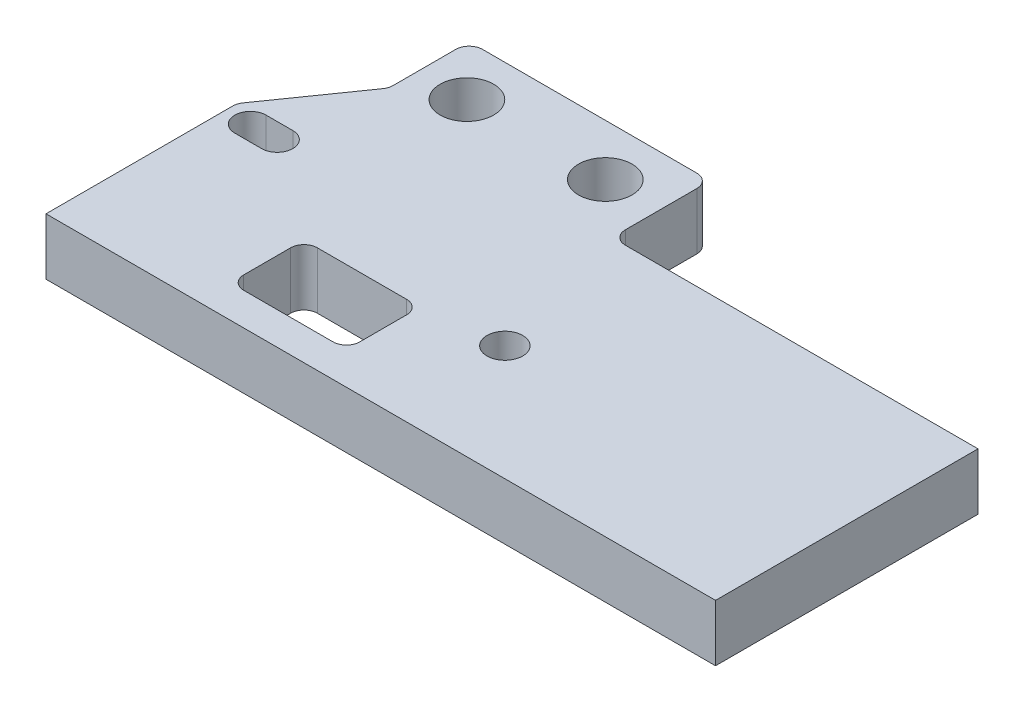
ISO-10303-21;
HEADER;
FILE_DESCRIPTION(('STEP AP214'),'2;1');
FILE_NAME('part.step','',(''),(''),'','','');
FILE_SCHEMA(('AUTOMOTIVE_DESIGN { 1 0 10303 214 1 1 1 1 }'));
ENDSEC;
DATA;
#1=APPLICATION_CONTEXT('core data for automotive mechanical design processes');
#2=APPLICATION_PROTOCOL_DEFINITION('international standard','automotive_design',2000,#1);
#3=PRODUCT_CONTEXT('',#1,'mechanical');
#4=PRODUCT('Part','Part','',(#3));
#5=PRODUCT_RELATED_PRODUCT_CATEGORY('part','',(#4));
#6=PRODUCT_DEFINITION_FORMATION('','',#4);
#7=PRODUCT_DEFINITION_CONTEXT('part definition',#1,'design');
#8=PRODUCT_DEFINITION('design','',#6,#7);
#9=PRODUCT_DEFINITION_SHAPE('','',#8);
#10=(LENGTH_UNIT() NAMED_UNIT(*) SI_UNIT(.MILLI.,.METRE.));
#11=(NAMED_UNIT(*) PLANE_ANGLE_UNIT() SI_UNIT($,.RADIAN.));
#12=(NAMED_UNIT(*) SI_UNIT($,.STERADIAN.) SOLID_ANGLE_UNIT());
#13=UNCERTAINTY_MEASURE_WITH_UNIT(LENGTH_MEASURE(1.E-05),#10,'distance_accuracy_value','');
#14=(GEOMETRIC_REPRESENTATION_CONTEXT(3) GLOBAL_UNCERTAINTY_ASSIGNED_CONTEXT((#13)) GLOBAL_UNIT_ASSIGNED_CONTEXT((#10,
#11,#12)) REPRESENTATION_CONTEXT('',''));
#15=CARTESIAN_POINT('',(0.,0.,0.));
#16=DIRECTION('',(0.,0.,1.));
#17=DIRECTION('',(1.,0.,0.));
#18=AXIS2_PLACEMENT_3D('',#15,#16,#17);
#19=CARTESIAN_POINT('',(0.,6.35,0.));
#20=DIRECTION('',(0.,-1.,0.));
#21=DIRECTION('',(0.,0.,-1.));
#22=AXIS2_PLACEMENT_3D('',#19,#20,#21);
#23=PLANE('',#22);
#24=CARTESIAN_POINT('',(28.,6.35,-61.75));
#25=DIRECTION('',(0.,1.,0.));
#26=DIRECTION('',(0.,0.,1.));
#27=AXIS2_PLACEMENT_3D('',#24,#25,#26);
#28=CIRCLE('',#27,3.);
#29=CARTESIAN_POINT('',(28.,6.35,-58.75));
#30=VERTEX_POINT('',#29);
#31=EDGE_CURVE('E224',#30,#30,#28,.T.);
#32=ORIENTED_EDGE('',*,*,#31,.F.);
#33=EDGE_LOOP('',(#32));
#34=FACE_BOUND('',#33,.T.);
#35=CARTESIAN_POINT('',(12.5,6.35,-61.75));
#36=DIRECTION('',(0.,1.,0.));
#37=DIRECTION('',(0.,0.,1.));
#38=AXIS2_PLACEMENT_3D('',#35,#36,#37);
#39=CIRCLE('',#38,3.);
#40=CARTESIAN_POINT('',(12.5,6.35,-58.75));
#41=VERTEX_POINT('',#40);
#42=EDGE_CURVE('E228',#41,#41,#39,.T.);
#43=ORIENTED_EDGE('',*,*,#42,.F.);
#44=EDGE_LOOP('',(#43));
#45=FACE_BOUND('',#44,.T.);
#46=CARTESIAN_POINT('',(2.75,6.35,-47.25));
#47=DIRECTION('',(0.,1.,0.));
#48=DIRECTION('',(0.,0.,-1.));
#49=AXIS2_PLACEMENT_3D('',#46,#47,#48);
#50=CIRCLE('',#49,1.75);
#51=CARTESIAN_POINT('',(2.75,6.35,-49.));
#52=VERTEX_POINT('',#51);
#53=CARTESIAN_POINT('',(2.75,6.35,-45.5));
#54=VERTEX_POINT('',#53);
#55=EDGE_CURVE('E239',#52,#54,#50,.T.);
#56=ORIENTED_EDGE('',*,*,#55,.F.);
#57=DIRECTION('',(-1.,0.,0.));
#58=VECTOR('',#57,1.);
#59=CARTESIAN_POINT('',(2.75,6.35,-49.));
#60=LINE('',#59,#58);
#61=CARTESIAN_POINT('',(5.75,6.35,-49.));
#62=VERTEX_POINT('',#61);
#63=EDGE_CURVE('E250',#62,#52,#60,.T.);
#64=ORIENTED_EDGE('',*,*,#63,.F.);
#65=CARTESIAN_POINT('',(5.75,6.35,-47.25));
#66=DIRECTION('',(0.,1.,0.));
#67=DIRECTION('',(0.,0.,-1.));
#68=AXIS2_PLACEMENT_3D('',#65,#66,#67);
#69=CIRCLE('',#68,1.75);
#70=CARTESIAN_POINT('',(5.75,6.35,-45.5));
#71=VERTEX_POINT('',#70);
#72=EDGE_CURVE('E246',#71,#62,#69,.T.);
#73=ORIENTED_EDGE('',*,*,#72,.F.);
#74=DIRECTION('',(1.,0.,0.));
#75=VECTOR('',#74,1.);
#76=CARTESIAN_POINT('',(2.75,6.35,-45.5));
#77=LINE('',#76,#75);
#78=EDGE_CURVE('E243',#54,#71,#77,.T.);
#79=ORIENTED_EDGE('',*,*,#78,.F.);
#80=EDGE_LOOP('',(#56,#64,#73,#79));
#81=FACE_BOUND('',#80,.T.);
#82=CARTESIAN_POINT('',(38.5,6.35,-40.));
#83=DIRECTION('',(0.,1.,0.));
#84=DIRECTION('',(0.,0.,1.));
#85=AXIS2_PLACEMENT_3D('',#82,#83,#84);
#86=CIRCLE('',#85,2.);
#87=CARTESIAN_POINT('',(38.5,6.35,-38.));
#88=VERTEX_POINT('',#87);
#89=EDGE_CURVE('E242',#88,#88,#86,.T.);
#90=ORIENTED_EDGE('',*,*,#89,.F.);
#91=EDGE_LOOP('',(#90));
#92=FACE_BOUND('',#91,.T.);
#93=DIRECTION('',(0.,0.,1.));
#94=VECTOR('',#93,1.);
#95=CARTESIAN_POINT('',(17.,6.35,-39.));
#96=LINE('',#95,#94);
#97=CARTESIAN_POINT('',(17.,6.35,-37.5));
#98=VERTEX_POINT('',#97);
#99=CARTESIAN_POINT('',(17.,6.35,-32.25));
#100=VERTEX_POINT('',#99);
#101=EDGE_CURVE('E276',#98,#100,#96,.T.);
#102=ORIENTED_EDGE('',*,*,#101,.F.);
#103=CARTESIAN_POINT('',(18.5,6.35,-37.5));
#104=DIRECTION('',(0.,-1.,0.));
#105=DIRECTION('',(0.,0.,-1.));
#106=AXIS2_PLACEMENT_3D('',#103,#104,#105);
#107=CIRCLE('',#106,1.5);
#108=CARTESIAN_POINT('',(18.5,6.35,-39.));
#109=VERTEX_POINT('',#108);
#110=EDGE_CURVE('E390',#98,#109,#107,.T.);
#111=ORIENTED_EDGE('',*,*,#110,.T.);
#112=DIRECTION('',(-1.,0.,0.));
#113=VECTOR('',#112,1.);
#114=CARTESIAN_POINT('',(17.,6.35,-39.));
#115=LINE('',#114,#113);
#116=CARTESIAN_POINT('',(28.5,6.35,-39.));
#117=VERTEX_POINT('',#116);
#118=EDGE_CURVE('E291',#117,#109,#115,.T.);
#119=ORIENTED_EDGE('',*,*,#118,.F.);
#120=CARTESIAN_POINT('',(28.5,6.35,-37.5));
#121=DIRECTION('',(0.,-1.,0.));
#122=DIRECTION('',(0.,0.,-1.));
#123=AXIS2_PLACEMENT_3D('',#120,#121,#122);
#124=CIRCLE('',#123,1.5);
#125=CARTESIAN_POINT('',(30.,6.35,-37.5));
#126=VERTEX_POINT('',#125);
#127=EDGE_CURVE('E392',#117,#126,#124,.T.);
#128=ORIENTED_EDGE('',*,*,#127,.T.);
#129=DIRECTION('',(0.,0.,-1.));
#130=VECTOR('',#129,1.);
#131=CARTESIAN_POINT('',(30.,6.35,-39.));
#132=LINE('',#131,#130);
#133=CARTESIAN_POINT('',(30.,6.35,-32.25));
#134=VERTEX_POINT('',#133);
#135=EDGE_CURVE('E286',#134,#126,#132,.T.);
#136=ORIENTED_EDGE('',*,*,#135,.F.);
#137=CARTESIAN_POINT('',(28.5,6.35,-32.25));
#138=DIRECTION('',(0.,-1.,0.));
#139=DIRECTION('',(0.,0.,-1.));
#140=AXIS2_PLACEMENT_3D('',#137,#138,#139);
#141=CIRCLE('',#140,1.5);
#142=CARTESIAN_POINT('',(28.5,6.35,-30.75));
#143=VERTEX_POINT('',#142);
#144=EDGE_CURVE('E388',#134,#143,#141,.T.);
#145=ORIENTED_EDGE('',*,*,#144,.T.);
#146=DIRECTION('',(1.,0.,0.));
#147=VECTOR('',#146,1.);
#148=CARTESIAN_POINT('',(17.,6.35,-30.75));
#149=LINE('',#148,#147);
#150=CARTESIAN_POINT('',(18.5,6.35,-30.75));
#151=VERTEX_POINT('',#150);
#152=EDGE_CURVE('E281',#151,#143,#149,.T.);
#153=ORIENTED_EDGE('',*,*,#152,.F.);
#154=CARTESIAN_POINT('',(18.5,6.35,-32.25));
#155=DIRECTION('',(0.,-1.,0.));
#156=DIRECTION('',(0.,0.,-1.));
#157=AXIS2_PLACEMENT_3D('',#154,#155,#156);
#158=CIRCLE('',#157,1.5);
#159=EDGE_CURVE('E221',#151,#100,#158,.T.);
#160=ORIENTED_EDGE('',*,*,#159,.T.);
#161=EDGE_LOOP('',(#102,#111,#119,#128,#136,#145,#153,#160));
#162=FACE_BOUND('',#161,.T.);
#163=DIRECTION('',(0.,0.,1.));
#164=VECTOR('',#163,1.);
#165=CARTESIAN_POINT('',(0.,6.35,0.));
#166=LINE('',#165,#164);
#167=CARTESIAN_POINT('',(0.,6.35,-48.0271666537713));
#168=VERTEX_POINT('',#167);
#169=CARTESIAN_POINT('',(0.,6.35,-27.1));
#170=VERTEX_POINT('',#169);
#171=EDGE_CURVE('E205',#168,#170,#166,.T.);
#172=ORIENTED_EDGE('',*,*,#171,.T.);
#173=DIRECTION('',(1.,0.,0.));
#174=VECTOR('',#173,1.);
#175=CARTESIAN_POINT('',(-15.,6.35,-27.1));
#176=LINE('',#175,#174);
#177=CARTESIAN_POINT('',(75.,6.35,-27.1));
#178=VERTEX_POINT('',#177);
#179=EDGE_CURVE('E195',#170,#178,#176,.T.);
#180=ORIENTED_EDGE('',*,*,#179,.T.);
#181=DIRECTION('',(0.,0.,1.));
#182=VECTOR('',#181,1.);
#183=CARTESIAN_POINT('',(75.,6.35,0.));
#184=LINE('',#183,#182);
#185=CARTESIAN_POINT('',(75.,6.35,-56.5));
#186=VERTEX_POINT('',#185);
#187=EDGE_CURVE('E202',#186,#178,#184,.T.);
#188=ORIENTED_EDGE('',*,*,#187,.F.);
#189=DIRECTION('',(-1.,0.,0.));
#190=VECTOR('',#189,1.);
#191=CARTESIAN_POINT('',(34.,6.35,-56.5));
#192=LINE('',#191,#190);
#193=CARTESIAN_POINT('',(35.5,6.35,-56.5));
#194=VERTEX_POINT('',#193);
#195=EDGE_CURVE('E206',#186,#194,#192,.T.);
#196=ORIENTED_EDGE('',*,*,#195,.T.);
#197=CARTESIAN_POINT('',(35.5,6.35,-58.));
#198=DIRECTION('',(0.,-1.,0.));
#199=DIRECTION('',(0.,0.,-1.));
#200=AXIS2_PLACEMENT_3D('',#197,#198,#199);
#201=CIRCLE('',#200,1.5);
#202=CARTESIAN_POINT('',(34.,6.35,-58.));
#203=VERTEX_POINT('',#202);
#204=EDGE_CURVE('E310',#194,#203,#201,.T.);
#205=ORIENTED_EDGE('',*,*,#204,.T.);
#206=DIRECTION('',(0.,0.,-1.));
#207=VECTOR('',#206,1.);
#208=CARTESIAN_POINT('',(34.,6.35,-67.5));
#209=LINE('',#208,#207);
#210=CARTESIAN_POINT('',(34.,6.35,-66.));
#211=VERTEX_POINT('',#210);
#212=EDGE_CURVE('E311',#203,#211,#209,.T.);
#213=ORIENTED_EDGE('',*,*,#212,.T.);
#214=CARTESIAN_POINT('',(32.5,6.35,-66.));
#215=DIRECTION('',(0.,-1.,0.));
#216=DIRECTION('',(0.,0.,-1.));
#217=AXIS2_PLACEMENT_3D('',#214,#215,#216);
#218=CIRCLE('',#217,1.5);
#219=CARTESIAN_POINT('',(32.5,6.35,-67.5));
#220=VERTEX_POINT('',#219);
#221=EDGE_CURVE('E314',#211,#220,#218,.F.);
#222=ORIENTED_EDGE('',*,*,#221,.T.);
#223=DIRECTION('',(-1.,0.,0.));
#224=VECTOR('',#223,1.);
#225=CARTESIAN_POINT('',(7.,6.35,-67.5));
#226=LINE('',#225,#224);
#227=CARTESIAN_POINT('',(8.5,6.35,-67.5));
#228=VERTEX_POINT('',#227);
#229=EDGE_CURVE('E315',#220,#228,#226,.T.);
#230=ORIENTED_EDGE('',*,*,#229,.T.);
#231=CARTESIAN_POINT('',(8.5,6.35,-66.));
#232=DIRECTION('',(0.,-1.,0.));
#233=DIRECTION('',(0.,0.,-1.));
#234=AXIS2_PLACEMENT_3D('',#231,#232,#233);
#235=CIRCLE('',#234,1.5);
#236=CARTESIAN_POINT('',(7.,6.35,-66.));
#237=VERTEX_POINT('',#236);
#238=EDGE_CURVE('E318',#228,#237,#235,.F.);
#239=ORIENTED_EDGE('',*,*,#238,.T.);
#240=DIRECTION('',(0.,0.,1.));
#241=VECTOR('',#240,1.);
#242=CARTESIAN_POINT('',(7.,6.35,-58.5));
#243=LINE('',#242,#241);
#244=CARTESIAN_POINT('',(7.,6.35,-58.9728333462287));
#245=VERTEX_POINT('',#244);
#246=EDGE_CURVE('E319',#237,#245,#243,.T.);
#247=ORIENTED_EDGE('',*,*,#246,.T.);
#248=CARTESIAN_POINT('',(5.5,6.35,-58.9728333462287));
#249=DIRECTION('',(0.,-1.,0.));
#250=DIRECTION('',(0.,0.,-1.));
#251=AXIS2_PLACEMENT_3D('',#248,#249,#250);
#252=CIRCLE('',#251,1.5);
#253=CARTESIAN_POINT('',(6.72884788077856,6.35,-58.1126398296837));
#254=VERTEX_POINT('',#253);
#255=EDGE_CURVE('E322',#245,#254,#252,.T.);
#256=ORIENTED_EDGE('',*,*,#255,.T.);
#257=DIRECTION('',(-0.573462344363328,0.,0.819231920519041));
#258=VECTOR('',#257,1.);
#259=CARTESIAN_POINT('',(0.,6.35,-48.5));
#260=LINE('',#259,#258);
#261=CARTESIAN_POINT('',(0.271152119221439,6.35,-48.8873601703163));
#262=VERTEX_POINT('',#261);
#263=EDGE_CURVE('E323',#254,#262,#260,.T.);
#264=ORIENTED_EDGE('',*,*,#263,.T.);
#265=CARTESIAN_POINT('',(1.5,6.35,-48.0271666537714));
#266=DIRECTION('',(0.,-1.,0.));
#267=DIRECTION('',(0.,0.,-1.));
#268=AXIS2_PLACEMENT_3D('',#265,#266,#267);
#269=CIRCLE('',#268,1.5);
#270=EDGE_CURVE('E325',#262,#168,#269,.F.);
#271=ORIENTED_EDGE('',*,*,#270,.T.);
#272=EDGE_LOOP('',(#172,#180,#188,#196,#205,#213,#222,#230,#239,#247,#256,#264,#271));
#273=FACE_BOUND('',#272,.T.);
#274=ADVANCED_FACE('F32',(#34,#45,#81,#92,#162,#273),#23,.F.);
#275=CARTESIAN_POINT('',(0.,0.,0.));
#276=DIRECTION('',(0.,-1.,0.));
#277=DIRECTION('',(0.,0.,-1.));
#278=AXIS2_PLACEMENT_3D('',#275,#276,#277);
#279=PLANE('',#278);
#280=DIRECTION('',(1.,0.,0.));
#281=VECTOR('',#280,1.);
#282=CARTESIAN_POINT('',(-15.,0.,-27.1));
#283=LINE('',#282,#281);
#284=CARTESIAN_POINT('',(0.,0.,-27.1));
#285=VERTEX_POINT('',#284);
#286=CARTESIAN_POINT('',(75.,0.,-27.1));
#287=VERTEX_POINT('',#286);
#288=EDGE_CURVE('E41',#285,#287,#283,.T.);
#289=ORIENTED_EDGE('',*,*,#288,.F.);
#290=DIRECTION('',(0.,0.,1.));
#291=VECTOR('',#290,1.);
#292=CARTESIAN_POINT('',(0.,0.,0.));
#293=LINE('',#292,#291);
#294=CARTESIAN_POINT('',(0.,0.,-48.0271666537713));
#295=VERTEX_POINT('',#294);
#296=EDGE_CURVE('E217',#295,#285,#293,.T.);
#297=ORIENTED_EDGE('',*,*,#296,.F.);
#298=CARTESIAN_POINT('',(1.5,0.,-48.0271666537714));
#299=DIRECTION('',(0.,-1.,0.));
#300=DIRECTION('',(0.,0.,-1.));
#301=AXIS2_PLACEMENT_3D('',#298,#299,#300);
#302=CIRCLE('',#301,1.5);
#303=CARTESIAN_POINT('',(0.271152119221439,0.,-48.8873601703163));
#304=VERTEX_POINT('',#303);
#305=EDGE_CURVE('E359',#295,#304,#302,.T.);
#306=ORIENTED_EDGE('',*,*,#305,.T.);
#307=DIRECTION('',(-0.573462344363328,0.,0.819231920519041));
#308=VECTOR('',#307,1.);
#309=CARTESIAN_POINT('',(0.,0.,-48.5));
#310=LINE('',#309,#308);
#311=CARTESIAN_POINT('',(6.72884788077856,0.,-58.1126398296837));
#312=VERTEX_POINT('',#311);
#313=EDGE_CURVE('E342',#312,#304,#310,.T.);
#314=ORIENTED_EDGE('',*,*,#313,.F.);
#315=CARTESIAN_POINT('',(5.5,0.,-58.9728333462287));
#316=DIRECTION('',(0.,-1.,0.));
#317=DIRECTION('',(0.,0.,-1.));
#318=AXIS2_PLACEMENT_3D('',#315,#316,#317);
#319=CIRCLE('',#318,1.5);
#320=CARTESIAN_POINT('',(7.,0.,-58.9728333462287));
#321=VERTEX_POINT('',#320);
#322=EDGE_CURVE('E361',#312,#321,#319,.F.);
#323=ORIENTED_EDGE('',*,*,#322,.T.);
#324=DIRECTION('',(0.,0.,1.));
#325=VECTOR('',#324,1.);
#326=CARTESIAN_POINT('',(7.,0.,-58.5));
#327=LINE('',#326,#325);
#328=CARTESIAN_POINT('',(7.,0.,-66.));
#329=VERTEX_POINT('',#328);
#330=EDGE_CURVE('E337',#329,#321,#327,.T.);
#331=ORIENTED_EDGE('',*,*,#330,.F.);
#332=CARTESIAN_POINT('',(8.5,0.,-66.));
#333=DIRECTION('',(0.,-1.,0.));
#334=DIRECTION('',(0.,0.,-1.));
#335=AXIS2_PLACEMENT_3D('',#332,#333,#334);
#336=CIRCLE('',#335,1.5);
#337=CARTESIAN_POINT('',(8.5,0.,-67.5));
#338=VERTEX_POINT('',#337);
#339=EDGE_CURVE('E362',#329,#338,#336,.T.);
#340=ORIENTED_EDGE('',*,*,#339,.T.);
#341=DIRECTION('',(-1.,0.,0.));
#342=VECTOR('',#341,1.);
#343=CARTESIAN_POINT('',(7.,0.,-67.5));
#344=LINE('',#343,#342);
#345=CARTESIAN_POINT('',(32.5,0.,-67.5));
#346=VERTEX_POINT('',#345);
#347=EDGE_CURVE('E332',#346,#338,#344,.T.);
#348=ORIENTED_EDGE('',*,*,#347,.F.);
#349=CARTESIAN_POINT('',(32.5,0.,-66.));
#350=DIRECTION('',(0.,-1.,0.));
#351=DIRECTION('',(0.,0.,-1.));
#352=AXIS2_PLACEMENT_3D('',#349,#350,#351);
#353=CIRCLE('',#352,1.5);
#354=CARTESIAN_POINT('',(34.,0.,-66.));
#355=VERTEX_POINT('',#354);
#356=EDGE_CURVE('E364',#346,#355,#353,.T.);
#357=ORIENTED_EDGE('',*,*,#356,.T.);
#358=DIRECTION('',(0.,0.,-1.));
#359=VECTOR('',#358,1.);
#360=CARTESIAN_POINT('',(34.,0.,-67.5));
#361=LINE('',#360,#359);
#362=CARTESIAN_POINT('',(34.,0.,-58.));
#363=VERTEX_POINT('',#362);
#364=EDGE_CURVE('E327',#363,#355,#361,.T.);
#365=ORIENTED_EDGE('',*,*,#364,.F.);
#366=CARTESIAN_POINT('',(35.5,0.,-58.));
#367=DIRECTION('',(0.,-1.,0.));
#368=DIRECTION('',(0.,0.,-1.));
#369=AXIS2_PLACEMENT_3D('',#366,#367,#368);
#370=CIRCLE('',#369,1.5);
#371=CARTESIAN_POINT('',(35.5,0.,-56.5));
#372=VERTEX_POINT('',#371);
#373=EDGE_CURVE('E366',#363,#372,#370,.F.);
#374=ORIENTED_EDGE('',*,*,#373,.T.);
#375=DIRECTION('',(-1.,0.,0.));
#376=VECTOR('',#375,1.);
#377=CARTESIAN_POINT('',(34.,0.,-56.5));
#378=LINE('',#377,#376);
#379=CARTESIAN_POINT('',(75.,0.,-56.5));
#380=VERTEX_POINT('',#379);
#381=EDGE_CURVE('E211',#380,#372,#378,.T.);
#382=ORIENTED_EDGE('',*,*,#381,.F.);
#383=DIRECTION('',(0.,0.,1.));
#384=VECTOR('',#383,1.);
#385=CARTESIAN_POINT('',(75.,0.,0.));
#386=LINE('',#385,#384);
#387=EDGE_CURVE('E35',#380,#287,#386,.T.);
#388=ORIENTED_EDGE('',*,*,#387,.T.);
#389=EDGE_LOOP('',(#289,#297,#306,#314,#323,#331,#340,#348,#357,#365,#374,#382,#388));
#390=FACE_BOUND('',#389,.T.);
#391=CARTESIAN_POINT('',(28.,0.,-61.75));
#392=DIRECTION('',(0.,1.,0.));
#393=DIRECTION('',(0.,0.,1.));
#394=AXIS2_PLACEMENT_3D('',#391,#392,#393);
#395=CIRCLE('',#394,3.);
#396=CARTESIAN_POINT('',(28.,0.,-58.75));
#397=VERTEX_POINT('',#396);
#398=EDGE_CURVE('E229',#397,#397,#395,.T.);
#399=ORIENTED_EDGE('',*,*,#398,.T.);
#400=EDGE_LOOP('',(#399));
#401=FACE_BOUND('',#400,.T.);
#402=DIRECTION('',(-1.,0.,0.));
#403=VECTOR('',#402,1.);
#404=CARTESIAN_POINT('',(2.75,0.,-49.));
#405=LINE('',#404,#403);
#406=CARTESIAN_POINT('',(5.75,0.,-49.));
#407=VERTEX_POINT('',#406);
#408=CARTESIAN_POINT('',(2.75,0.,-49.));
#409=VERTEX_POINT('',#408);
#410=EDGE_CURVE('E232',#407,#409,#405,.T.);
#411=ORIENTED_EDGE('',*,*,#410,.T.);
#412=CARTESIAN_POINT('',(2.75,0.,-47.25));
#413=DIRECTION('',(0.,1.,0.));
#414=DIRECTION('',(0.,0.,-1.));
#415=AXIS2_PLACEMENT_3D('',#412,#413,#414);
#416=CIRCLE('',#415,1.75);
#417=CARTESIAN_POINT('',(2.75,0.,-45.5));
#418=VERTEX_POINT('',#417);
#419=EDGE_CURVE('E252',#409,#418,#416,.T.);
#420=ORIENTED_EDGE('',*,*,#419,.T.);
#421=DIRECTION('',(1.,0.,0.));
#422=VECTOR('',#421,1.);
#423=CARTESIAN_POINT('',(2.75,0.,-45.5));
#424=LINE('',#423,#422);
#425=CARTESIAN_POINT('',(5.75,0.,-45.5));
#426=VERTEX_POINT('',#425);
#427=EDGE_CURVE('E255',#418,#426,#424,.T.);
#428=ORIENTED_EDGE('',*,*,#427,.T.);
#429=CARTESIAN_POINT('',(5.75,0.,-47.25));
#430=DIRECTION('',(0.,1.,0.));
#431=DIRECTION('',(0.,0.,-1.));
#432=AXIS2_PLACEMENT_3D('',#429,#430,#431);
#433=CIRCLE('',#432,1.75);
#434=EDGE_CURVE('E258',#426,#407,#433,.T.);
#435=ORIENTED_EDGE('',*,*,#434,.T.);
#436=EDGE_LOOP('',(#411,#420,#428,#435));
#437=FACE_BOUND('',#436,.T.);
#438=DIRECTION('',(0.,0.,-1.));
#439=VECTOR('',#438,1.);
#440=CARTESIAN_POINT('',(30.,0.,-39.));
#441=LINE('',#440,#439);
#442=CARTESIAN_POINT('',(30.,0.,-32.25));
#443=VERTEX_POINT('',#442);
#444=CARTESIAN_POINT('',(30.,0.,-37.5));
#445=VERTEX_POINT('',#444);
#446=EDGE_CURVE('E261',#443,#445,#441,.T.);
#447=ORIENTED_EDGE('',*,*,#446,.T.);
#448=CARTESIAN_POINT('',(28.5,0.,-37.5));
#449=DIRECTION('',(0.,-1.,0.));
#450=DIRECTION('',(0.,0.,-1.));
#451=AXIS2_PLACEMENT_3D('',#448,#449,#450);
#452=CIRCLE('',#451,1.5);
#453=CARTESIAN_POINT('',(28.5,0.,-39.));
#454=VERTEX_POINT('',#453);
#455=EDGE_CURVE('E305',#445,#454,#452,.F.);
#456=ORIENTED_EDGE('',*,*,#455,.T.);
#457=DIRECTION('',(-1.,0.,0.));
#458=VECTOR('',#457,1.);
#459=CARTESIAN_POINT('',(17.,0.,-39.));
#460=LINE('',#459,#458);
#461=CARTESIAN_POINT('',(18.5,0.,-39.));
#462=VERTEX_POINT('',#461);
#463=EDGE_CURVE('E306',#454,#462,#460,.T.);
#464=ORIENTED_EDGE('',*,*,#463,.T.);
#465=CARTESIAN_POINT('',(18.5,0.,-37.5));
#466=DIRECTION('',(0.,-1.,0.));
#467=DIRECTION('',(0.,0.,-1.));
#468=AXIS2_PLACEMENT_3D('',#465,#466,#467);
#469=CIRCLE('',#468,1.5);
#470=CARTESIAN_POINT('',(17.,0.,-37.5));
#471=VERTEX_POINT('',#470);
#472=EDGE_CURVE('E299',#462,#471,#469,.F.);
#473=ORIENTED_EDGE('',*,*,#472,.T.);
#474=DIRECTION('',(0.,0.,1.));
#475=VECTOR('',#474,1.);
#476=CARTESIAN_POINT('',(17.,0.,-39.));
#477=LINE('',#476,#475);
#478=CARTESIAN_POINT('',(17.,0.,-32.25));
#479=VERTEX_POINT('',#478);
#480=EDGE_CURVE('E295',#471,#479,#477,.T.);
#481=ORIENTED_EDGE('',*,*,#480,.T.);
#482=CARTESIAN_POINT('',(18.5,0.,-32.25));
#483=DIRECTION('',(0.,-1.,0.));
#484=DIRECTION('',(0.,0.,-1.));
#485=AXIS2_PLACEMENT_3D('',#482,#483,#484);
#486=CIRCLE('',#485,1.5);
#487=CARTESIAN_POINT('',(18.5,0.,-30.75));
#488=VERTEX_POINT('',#487);
#489=EDGE_CURVE('E298',#479,#488,#486,.F.);
#490=ORIENTED_EDGE('',*,*,#489,.T.);
#491=DIRECTION('',(1.,0.,0.));
#492=VECTOR('',#491,1.);
#493=CARTESIAN_POINT('',(17.,0.,-30.75));
#494=LINE('',#493,#492);
#495=CARTESIAN_POINT('',(28.5,0.,-30.75));
#496=VERTEX_POINT('',#495);
#497=EDGE_CURVE('E300',#488,#496,#494,.T.);
#498=ORIENTED_EDGE('',*,*,#497,.T.);
#499=CARTESIAN_POINT('',(28.5,0.,-32.25));
#500=DIRECTION('',(0.,-1.,0.));
#501=DIRECTION('',(0.,0.,-1.));
#502=AXIS2_PLACEMENT_3D('',#499,#500,#501);
#503=CIRCLE('',#502,1.5);
#504=EDGE_CURVE('E275',#496,#443,#503,.F.);
#505=ORIENTED_EDGE('',*,*,#504,.T.);
#506=EDGE_LOOP('',(#447,#456,#464,#473,#481,#490,#498,#505));
#507=FACE_BOUND('',#506,.T.);
#508=CARTESIAN_POINT('',(38.5,0.,-40.));
#509=DIRECTION('',(0.,1.,0.));
#510=DIRECTION('',(0.,0.,1.));
#511=AXIS2_PLACEMENT_3D('',#508,#509,#510);
#512=CIRCLE('',#511,2.);
#513=CARTESIAN_POINT('',(38.5,0.,-38.));
#514=VERTEX_POINT('',#513);
#515=EDGE_CURVE('E238',#514,#514,#512,.T.);
#516=ORIENTED_EDGE('',*,*,#515,.T.);
#517=EDGE_LOOP('',(#516));
#518=FACE_BOUND('',#517,.T.);
#519=CARTESIAN_POINT('',(12.5,0.,-61.75));
#520=DIRECTION('',(0.,1.,0.));
#521=DIRECTION('',(0.,0.,1.));
#522=AXIS2_PLACEMENT_3D('',#519,#520,#521);
#523=CIRCLE('',#522,3.);
#524=CARTESIAN_POINT('',(12.5,0.,-58.75));
#525=VERTEX_POINT('',#524);
#526=EDGE_CURVE('E220',#525,#525,#523,.T.);
#527=ORIENTED_EDGE('',*,*,#526,.T.);
#528=EDGE_LOOP('',(#527));
#529=FACE_BOUND('',#528,.T.);
#530=ADVANCED_FACE('F415',(#390,#401,#437,#507,#518,#529),#279,.T.);
#531=CARTESIAN_POINT('',(0.,6.35,0.));
#532=DIRECTION('',(1.,0.,0.));
#533=DIRECTION('',(0.,0.,-1.));
#534=AXIS2_PLACEMENT_3D('',#531,#532,#533);
#535=PLANE('',#534);
#536=ORIENTED_EDGE('',*,*,#296,.T.);
#537=DIRECTION('',(0.,1.,0.));
#538=VECTOR('',#537,1.);
#539=CARTESIAN_POINT('',(0.,6.35,-27.1));
#540=LINE('',#539,#538);
#541=EDGE_CURVE('E49',#285,#170,#540,.T.);
#542=ORIENTED_EDGE('',*,*,#541,.T.);
#543=ORIENTED_EDGE('',*,*,#171,.F.);
#544=DIRECTION('',(0.,-1.,0.));
#545=VECTOR('',#544,1.);
#546=CARTESIAN_POINT('',(0.,6.35,-48.0271666537714));
#547=LINE('',#546,#545);
#548=EDGE_CURVE('E214',#168,#295,#547,.T.);
#549=ORIENTED_EDGE('',*,*,#548,.T.);
#550=EDGE_LOOP('',(#536,#542,#543,#549));
#551=FACE_BOUND('',#550,.T.);
#552=ADVANCED_FACE('F453',(#551),#535,.F.);
#553=CARTESIAN_POINT('',(75.,0.,0.));
#554=DIRECTION('',(1.,0.,0.));
#555=DIRECTION('',(0.,0.,-1.));
#556=AXIS2_PLACEMENT_3D('',#553,#554,#555);
#557=PLANE('',#556);
#558=DIRECTION('',(0.,1.,0.));
#559=VECTOR('',#558,1.);
#560=CARTESIAN_POINT('',(75.,6.35,-27.1));
#561=LINE('',#560,#559);
#562=EDGE_CURVE('E11',#287,#178,#561,.T.);
#563=ORIENTED_EDGE('',*,*,#562,.F.);
#564=ORIENTED_EDGE('',*,*,#387,.F.);
#565=DIRECTION('',(0.,1.,0.));
#566=VECTOR('',#565,1.);
#567=CARTESIAN_POINT('',(75.,6.35,-56.5));
#568=LINE('',#567,#566);
#569=EDGE_CURVE('E210',#380,#186,#568,.T.);
#570=ORIENTED_EDGE('',*,*,#569,.T.);
#571=ORIENTED_EDGE('',*,*,#187,.T.);
#572=EDGE_LOOP('',(#563,#564,#570,#571));
#573=FACE_BOUND('',#572,.T.);
#574=ADVANCED_FACE('F208',(#573),#557,.T.);
#575=CARTESIAN_POINT('',(34.,6.35,-56.5));
#576=DIRECTION('',(0.,0.,1.));
#577=DIRECTION('',(1.,0.,0.));
#578=AXIS2_PLACEMENT_3D('',#575,#576,#577);
#579=PLANE('',#578);
#580=ORIENTED_EDGE('',*,*,#569,.F.);
#581=ORIENTED_EDGE('',*,*,#381,.T.);
#582=DIRECTION('',(0.,-1.,0.));
#583=VECTOR('',#582,1.);
#584=CARTESIAN_POINT('',(35.5,6.35,-56.5));
#585=LINE('',#584,#583);
#586=EDGE_CURVE('E212',#372,#194,#585,.F.);
#587=ORIENTED_EDGE('',*,*,#586,.T.);
#588=ORIENTED_EDGE('',*,*,#195,.F.);
#589=EDGE_LOOP('',(#580,#581,#587,#588));
#590=FACE_BOUND('',#589,.T.);
#591=ADVANCED_FACE('F444',(#590),#579,.F.);
#592=CARTESIAN_POINT('',(34.,6.35,-67.5));
#593=DIRECTION('',(-1.,0.,0.));
#594=DIRECTION('',(0.,0.,1.));
#595=AXIS2_PLACEMENT_3D('',#592,#593,#594);
#596=PLANE('',#595);
#597=ORIENTED_EDGE('',*,*,#212,.F.);
#598=DIRECTION('',(0.,-1.,0.));
#599=VECTOR('',#598,1.);
#600=CARTESIAN_POINT('',(34.,0.,-58.));
#601=LINE('',#600,#599);
#602=EDGE_CURVE('E331',#203,#363,#601,.T.);
#603=ORIENTED_EDGE('',*,*,#602,.T.);
#604=ORIENTED_EDGE('',*,*,#364,.T.);
#605=DIRECTION('',(0.,-1.,0.));
#606=VECTOR('',#605,1.);
#607=CARTESIAN_POINT('',(34.,6.35,-66.));
#608=LINE('',#607,#606);
#609=EDGE_CURVE('E330',#355,#211,#608,.F.);
#610=ORIENTED_EDGE('',*,*,#609,.T.);
#611=EDGE_LOOP('',(#597,#603,#604,#610));
#612=FACE_BOUND('',#611,.T.);
#613=ADVANCED_FACE('F436',(#612),#596,.F.);
#614=CARTESIAN_POINT('',(7.,6.35,-67.5));
#615=DIRECTION('',(0.,0.,1.));
#616=DIRECTION('',(1.,0.,0.));
#617=AXIS2_PLACEMENT_3D('',#614,#615,#616);
#618=PLANE('',#617);
#619=ORIENTED_EDGE('',*,*,#229,.F.);
#620=DIRECTION('',(0.,-1.,0.));
#621=VECTOR('',#620,1.);
#622=CARTESIAN_POINT('',(32.5,6.35,-67.5));
#623=LINE('',#622,#621);
#624=EDGE_CURVE('E336',#220,#346,#623,.T.);
#625=ORIENTED_EDGE('',*,*,#624,.T.);
#626=ORIENTED_EDGE('',*,*,#347,.T.);
#627=DIRECTION('',(0.,-1.,0.));
#628=VECTOR('',#627,1.);
#629=CARTESIAN_POINT('',(8.5,6.35,-67.5));
#630=LINE('',#629,#628);
#631=EDGE_CURVE('E335',#338,#228,#630,.F.);
#632=ORIENTED_EDGE('',*,*,#631,.T.);
#633=EDGE_LOOP('',(#619,#625,#626,#632));
#634=FACE_BOUND('',#633,.T.);
#635=ADVANCED_FACE('F427',(#634),#618,.F.);
#636=CARTESIAN_POINT('',(7.,6.35,-58.5));
#637=DIRECTION('',(1.,0.,0.));
#638=DIRECTION('',(0.,0.,-1.));
#639=AXIS2_PLACEMENT_3D('',#636,#637,#638);
#640=PLANE('',#639);
#641=ORIENTED_EDGE('',*,*,#246,.F.);
#642=DIRECTION('',(0.,-1.,0.));
#643=VECTOR('',#642,1.);
#644=CARTESIAN_POINT('',(7.,6.35,-66.));
#645=LINE('',#644,#643);
#646=EDGE_CURVE('E341',#237,#329,#645,.T.);
#647=ORIENTED_EDGE('',*,*,#646,.T.);
#648=ORIENTED_EDGE('',*,*,#330,.T.);
#649=DIRECTION('',(0.,-1.,0.));
#650=VECTOR('',#649,1.);
#651=CARTESIAN_POINT('',(7.,6.35,-58.9728333462287));
#652=LINE('',#651,#650);
#653=EDGE_CURVE('E340',#321,#245,#652,.F.);
#654=ORIENTED_EDGE('',*,*,#653,.T.);
#655=EDGE_LOOP('',(#641,#647,#648,#654));
#656=FACE_BOUND('',#655,.T.);
#657=ADVANCED_FACE('F418',(#656),#640,.F.);
#658=CARTESIAN_POINT('',(0.,6.35,-48.5));
#659=DIRECTION('',(0.81923192051904,0.,0.573462344363328));
#660=DIRECTION('',(0.573462344363328,0.,-0.819231920519041));
#661=AXIS2_PLACEMENT_3D('',#658,#659,#660);
#662=PLANE('',#661);
#663=ORIENTED_EDGE('',*,*,#263,.F.);
#664=DIRECTION('',(0.,-1.,0.));
#665=VECTOR('',#664,1.);
#666=CARTESIAN_POINT('',(6.72884788077856,0.,-58.1126398296837));
#667=LINE('',#666,#665);
#668=EDGE_CURVE('E345',#254,#312,#667,.T.);
#669=ORIENTED_EDGE('',*,*,#668,.T.);
#670=ORIENTED_EDGE('',*,*,#313,.T.);
#671=DIRECTION('',(0.,-1.,0.));
#672=VECTOR('',#671,1.);
#673=CARTESIAN_POINT('',(0.271152119221439,6.35,-48.8873601703163));
#674=LINE('',#673,#672);
#675=EDGE_CURVE('E280',#304,#262,#674,.F.);
#676=ORIENTED_EDGE('',*,*,#675,.T.);
#677=EDGE_LOOP('',(#663,#669,#670,#676));
#678=FACE_BOUND('',#677,.T.);
#679=ADVANCED_FACE('F409',(#678),#662,.F.);
#680=CARTESIAN_POINT('',(17.,6.35,-39.));
#681=DIRECTION('',(1.,0.,0.));
#682=DIRECTION('',(0.,0.,-1.));
#683=AXIS2_PLACEMENT_3D('',#680,#681,#682);
#684=PLANE('',#683);
#685=ORIENTED_EDGE('',*,*,#101,.T.);
#686=DIRECTION('',(0.,-1.,0.));
#687=VECTOR('',#686,1.);
#688=CARTESIAN_POINT('',(17.,0.,-32.25));
#689=LINE('',#688,#687);
#690=EDGE_CURVE('E279',#100,#479,#689,.T.);
#691=ORIENTED_EDGE('',*,*,#690,.T.);
#692=ORIENTED_EDGE('',*,*,#480,.F.);
#693=DIRECTION('',(0.,-1.,0.));
#694=VECTOR('',#693,1.);
#695=CARTESIAN_POINT('',(17.,6.35,-37.5));
#696=LINE('',#695,#694);
#697=EDGE_CURVE('E346',#471,#98,#696,.F.);
#698=ORIENTED_EDGE('',*,*,#697,.T.);
#699=EDGE_LOOP('',(#685,#691,#692,#698));
#700=FACE_BOUND('',#699,.T.);
#701=ADVANCED_FACE('F508',(#700),#684,.T.);
#702=CARTESIAN_POINT('',(17.,6.35,-30.75));
#703=DIRECTION('',(0.,0.,-1.));
#704=DIRECTION('',(-1.,0.,0.));
#705=AXIS2_PLACEMENT_3D('',#702,#703,#704);
#706=PLANE('',#705);
#707=ORIENTED_EDGE('',*,*,#497,.F.);
#708=DIRECTION('',(0.,-1.,0.));
#709=VECTOR('',#708,1.);
#710=CARTESIAN_POINT('',(18.5,6.35,-30.75));
#711=LINE('',#710,#709);
#712=EDGE_CURVE('E285',#488,#151,#711,.F.);
#713=ORIENTED_EDGE('',*,*,#712,.T.);
#714=ORIENTED_EDGE('',*,*,#152,.T.);
#715=DIRECTION('',(0.,-1.,0.));
#716=VECTOR('',#715,1.);
#717=CARTESIAN_POINT('',(28.5,0.,-30.75));
#718=LINE('',#717,#716);
#719=EDGE_CURVE('E284',#143,#496,#718,.T.);
#720=ORIENTED_EDGE('',*,*,#719,.T.);
#721=EDGE_LOOP('',(#707,#713,#714,#720));
#722=FACE_BOUND('',#721,.T.);
#723=ADVANCED_FACE('F504',(#722),#706,.T.);
#724=CARTESIAN_POINT('',(30.,6.35,-39.));
#725=DIRECTION('',(-1.,0.,0.));
#726=DIRECTION('',(0.,0.,1.));
#727=AXIS2_PLACEMENT_3D('',#724,#725,#726);
#728=PLANE('',#727);
#729=ORIENTED_EDGE('',*,*,#446,.F.);
#730=DIRECTION('',(0.,-1.,0.));
#731=VECTOR('',#730,1.);
#732=CARTESIAN_POINT('',(30.,6.35,-32.25));
#733=LINE('',#732,#731);
#734=EDGE_CURVE('E290',#443,#134,#733,.F.);
#735=ORIENTED_EDGE('',*,*,#734,.T.);
#736=ORIENTED_EDGE('',*,*,#135,.T.);
#737=DIRECTION('',(0.,-1.,0.));
#738=VECTOR('',#737,1.);
#739=CARTESIAN_POINT('',(30.,0.,-37.5));
#740=LINE('',#739,#738);
#741=EDGE_CURVE('E289',#126,#445,#740,.T.);
#742=ORIENTED_EDGE('',*,*,#741,.T.);
#743=EDGE_LOOP('',(#729,#735,#736,#742));
#744=FACE_BOUND('',#743,.T.);
#745=ADVANCED_FACE('F495',(#744),#728,.T.);
#746=CARTESIAN_POINT('',(17.,6.35,-39.));
#747=DIRECTION('',(0.,0.,1.));
#748=DIRECTION('',(1.,0.,0.));
#749=AXIS2_PLACEMENT_3D('',#746,#747,#748);
#750=PLANE('',#749);
#751=ORIENTED_EDGE('',*,*,#118,.T.);
#752=DIRECTION('',(0.,-1.,0.));
#753=VECTOR('',#752,1.);
#754=CARTESIAN_POINT('',(18.5,0.,-39.));
#755=LINE('',#754,#753);
#756=EDGE_CURVE('E294',#109,#462,#755,.T.);
#757=ORIENTED_EDGE('',*,*,#756,.T.);
#758=ORIENTED_EDGE('',*,*,#463,.F.);
#759=DIRECTION('',(0.,-1.,0.));
#760=VECTOR('',#759,1.);
#761=CARTESIAN_POINT('',(28.5,6.35,-39.));
#762=LINE('',#761,#760);
#763=EDGE_CURVE('E272',#454,#117,#762,.F.);
#764=ORIENTED_EDGE('',*,*,#763,.T.);
#765=EDGE_LOOP('',(#751,#757,#758,#764));
#766=FACE_BOUND('',#765,.T.);
#767=ADVANCED_FACE('F484',(#766),#750,.T.);
#768=CARTESIAN_POINT('',(38.5,6.35,-40.));
#769=DIRECTION('',(0.,-1.,0.));
#770=DIRECTION('',(0.,0.,-1.));
#771=AXIS2_PLACEMENT_3D('',#768,#769,#770);
#772=CYLINDRICAL_SURFACE('',#771,2.);
#773=ORIENTED_EDGE('',*,*,#89,.T.);
#774=EDGE_LOOP('',(#773));
#775=FACE_BOUND('',#774,.T.);
#776=ORIENTED_EDGE('',*,*,#515,.F.);
#777=EDGE_LOOP('',(#776));
#778=FACE_BOUND('',#777,.T.);
#779=ADVANCED_FACE('F523',(#775,#778),#772,.F.);
#780=CARTESIAN_POINT('',(2.75,6.35,-47.25));
#781=DIRECTION('',(0.,-1.,0.));
#782=DIRECTION('',(0.,0.,-1.));
#783=AXIS2_PLACEMENT_3D('',#780,#781,#782);
#784=CYLINDRICAL_SURFACE('',#783,1.75);
#785=ORIENTED_EDGE('',*,*,#419,.F.);
#786=DIRECTION('',(0.,-1.,0.));
#787=VECTOR('',#786,1.);
#788=CARTESIAN_POINT('',(2.75,6.35,-49.));
#789=LINE('',#788,#787);
#790=EDGE_CURVE('E235',#52,#409,#789,.T.);
#791=ORIENTED_EDGE('',*,*,#790,.F.);
#792=ORIENTED_EDGE('',*,*,#55,.T.);
#793=DIRECTION('',(0.,-1.,0.));
#794=VECTOR('',#793,1.);
#795=CARTESIAN_POINT('',(2.75,6.35,-45.5));
#796=LINE('',#795,#794);
#797=EDGE_CURVE('E241',#54,#418,#796,.T.);
#798=ORIENTED_EDGE('',*,*,#797,.T.);
#799=EDGE_LOOP('',(#785,#791,#792,#798));
#800=FACE_BOUND('',#799,.T.);
#801=ADVANCED_FACE('F526',(#800),#784,.F.);
#802=CARTESIAN_POINT('',(2.75,6.35,-45.5));
#803=DIRECTION('',(0.,0.,-1.));
#804=DIRECTION('',(-1.,0.,0.));
#805=AXIS2_PLACEMENT_3D('',#802,#803,#804);
#806=PLANE('',#805);
#807=ORIENTED_EDGE('',*,*,#427,.F.);
#808=ORIENTED_EDGE('',*,*,#797,.F.);
#809=ORIENTED_EDGE('',*,*,#78,.T.);
#810=DIRECTION('',(0.,-1.,0.));
#811=VECTOR('',#810,1.);
#812=CARTESIAN_POINT('',(5.75,6.35,-45.5));
#813=LINE('',#812,#811);
#814=EDGE_CURVE('E245',#71,#426,#813,.T.);
#815=ORIENTED_EDGE('',*,*,#814,.T.);
#816=EDGE_LOOP('',(#807,#808,#809,#815));
#817=FACE_BOUND('',#816,.T.);
#818=ADVANCED_FACE('F530',(#817),#806,.T.);
#819=CARTESIAN_POINT('',(5.75,6.35,-47.25));
#820=DIRECTION('',(0.,-1.,0.));
#821=DIRECTION('',(0.,0.,-1.));
#822=AXIS2_PLACEMENT_3D('',#819,#820,#821);
#823=CYLINDRICAL_SURFACE('',#822,1.75);
#824=ORIENTED_EDGE('',*,*,#434,.F.);
#825=ORIENTED_EDGE('',*,*,#814,.F.);
#826=ORIENTED_EDGE('',*,*,#72,.T.);
#827=DIRECTION('',(0.,-1.,0.));
#828=VECTOR('',#827,1.);
#829=CARTESIAN_POINT('',(5.75,6.35,-49.));
#830=LINE('',#829,#828);
#831=EDGE_CURVE('E249',#62,#407,#830,.T.);
#832=ORIENTED_EDGE('',*,*,#831,.T.);
#833=EDGE_LOOP('',(#824,#825,#826,#832));
#834=FACE_BOUND('',#833,.T.);
#835=ADVANCED_FACE('F534',(#834),#823,.F.);
#836=CARTESIAN_POINT('',(2.75,6.35,-49.));
#837=DIRECTION('',(0.,0.,1.));
#838=DIRECTION('',(1.,0.,0.));
#839=AXIS2_PLACEMENT_3D('',#836,#837,#838);
#840=PLANE('',#839);
#841=ORIENTED_EDGE('',*,*,#410,.F.);
#842=ORIENTED_EDGE('',*,*,#831,.F.);
#843=ORIENTED_EDGE('',*,*,#63,.T.);
#844=ORIENTED_EDGE('',*,*,#790,.T.);
#845=EDGE_LOOP('',(#841,#842,#843,#844));
#846=FACE_BOUND('',#845,.T.);
#847=ADVANCED_FACE('F538',(#846),#840,.T.);
#848=CARTESIAN_POINT('',(12.5,6.35,-61.75));
#849=DIRECTION('',(0.,-1.,0.));
#850=DIRECTION('',(0.,0.,-1.));
#851=AXIS2_PLACEMENT_3D('',#848,#849,#850);
#852=CYLINDRICAL_SURFACE('',#851,3.);
#853=ORIENTED_EDGE('',*,*,#42,.T.);
#854=EDGE_LOOP('',(#853));
#855=FACE_BOUND('',#854,.T.);
#856=ORIENTED_EDGE('',*,*,#526,.F.);
#857=EDGE_LOOP('',(#856));
#858=FACE_BOUND('',#857,.T.);
#859=ADVANCED_FACE('F542',(#855,#858),#852,.F.);
#860=CARTESIAN_POINT('',(28.,6.35,-61.75));
#861=DIRECTION('',(0.,-1.,0.));
#862=DIRECTION('',(0.,0.,-1.));
#863=AXIS2_PLACEMENT_3D('',#860,#861,#862);
#864=CYLINDRICAL_SURFACE('',#863,3.);
#865=ORIENTED_EDGE('',*,*,#31,.T.);
#866=EDGE_LOOP('',(#865));
#867=FACE_BOUND('',#866,.T.);
#868=ORIENTED_EDGE('',*,*,#398,.F.);
#869=EDGE_LOOP('',(#868));
#870=FACE_BOUND('',#869,.T.);
#871=ADVANCED_FACE('F546',(#867,#870),#864,.F.);
#872=CARTESIAN_POINT('',(18.5,6.35,-32.25));
#873=DIRECTION('',(0.,1.,0.));
#874=DIRECTION('',(0.,0.,1.));
#875=AXIS2_PLACEMENT_3D('',#872,#873,#874);
#876=CYLINDRICAL_SURFACE('',#875,1.5);
#877=ORIENTED_EDGE('',*,*,#159,.F.);
#878=ORIENTED_EDGE('',*,*,#712,.F.);
#879=ORIENTED_EDGE('',*,*,#489,.F.);
#880=ORIENTED_EDGE('',*,*,#690,.F.);
#881=EDGE_LOOP('',(#877,#878,#879,#880));
#882=FACE_BOUND('',#881,.T.);
#883=ADVANCED_FACE('F507',(#882),#876,.F.);
#884=CARTESIAN_POINT('',(18.5,6.35,-37.5));
#885=DIRECTION('',(0.,1.,0.));
#886=DIRECTION('',(0.,0.,1.));
#887=AXIS2_PLACEMENT_3D('',#884,#885,#886);
#888=CYLINDRICAL_SURFACE('',#887,1.5);
#889=ORIENTED_EDGE('',*,*,#110,.F.);
#890=ORIENTED_EDGE('',*,*,#697,.F.);
#891=ORIENTED_EDGE('',*,*,#472,.F.);
#892=ORIENTED_EDGE('',*,*,#756,.F.);
#893=EDGE_LOOP('',(#889,#890,#891,#892));
#894=FACE_BOUND('',#893,.T.);
#895=ADVANCED_FACE('F481',(#894),#888,.F.);
#896=CARTESIAN_POINT('',(28.5,6.35,-32.25));
#897=DIRECTION('',(0.,1.,0.));
#898=DIRECTION('',(0.,0.,1.));
#899=AXIS2_PLACEMENT_3D('',#896,#897,#898);
#900=CYLINDRICAL_SURFACE('',#899,1.5);
#901=ORIENTED_EDGE('',*,*,#144,.F.);
#902=ORIENTED_EDGE('',*,*,#734,.F.);
#903=ORIENTED_EDGE('',*,*,#504,.F.);
#904=ORIENTED_EDGE('',*,*,#719,.F.);
#905=EDGE_LOOP('',(#901,#902,#903,#904));
#906=FACE_BOUND('',#905,.T.);
#907=ADVANCED_FACE('F501',(#906),#900,.F.);
#908=CARTESIAN_POINT('',(28.5,6.35,-37.5));
#909=DIRECTION('',(0.,1.,0.));
#910=DIRECTION('',(0.,0.,1.));
#911=AXIS2_PLACEMENT_3D('',#908,#909,#910);
#912=CYLINDRICAL_SURFACE('',#911,1.5);
#913=ORIENTED_EDGE('',*,*,#127,.F.);
#914=ORIENTED_EDGE('',*,*,#763,.F.);
#915=ORIENTED_EDGE('',*,*,#455,.F.);
#916=ORIENTED_EDGE('',*,*,#741,.F.);
#917=EDGE_LOOP('',(#913,#914,#915,#916));
#918=FACE_BOUND('',#917,.T.);
#919=ADVANCED_FACE('F493',(#918),#912,.F.);
#920=CARTESIAN_POINT('',(35.5,6.35,-58.));
#921=DIRECTION('',(0.,1.,0.));
#922=DIRECTION('',(0.,0.,1.));
#923=AXIS2_PLACEMENT_3D('',#920,#921,#922);
#924=CYLINDRICAL_SURFACE('',#923,1.5);
#925=ORIENTED_EDGE('',*,*,#204,.F.);
#926=ORIENTED_EDGE('',*,*,#586,.F.);
#927=ORIENTED_EDGE('',*,*,#373,.F.);
#928=ORIENTED_EDGE('',*,*,#602,.F.);
#929=EDGE_LOOP('',(#925,#926,#927,#928));
#930=FACE_BOUND('',#929,.T.);
#931=ADVANCED_FACE('F440',(#930),#924,.F.);
#932=CARTESIAN_POINT('',(32.5,6.35,-66.));
#933=DIRECTION('',(0.,-1.,0.));
#934=DIRECTION('',(0.,0.,-1.));
#935=AXIS2_PLACEMENT_3D('',#932,#933,#934);
#936=CYLINDRICAL_SURFACE('',#935,1.5);
#937=ORIENTED_EDGE('',*,*,#221,.F.);
#938=ORIENTED_EDGE('',*,*,#609,.F.);
#939=ORIENTED_EDGE('',*,*,#356,.F.);
#940=ORIENTED_EDGE('',*,*,#624,.F.);
#941=EDGE_LOOP('',(#937,#938,#939,#940));
#942=FACE_BOUND('',#941,.T.);
#943=ADVANCED_FACE('F431',(#942),#936,.T.);
#944=CARTESIAN_POINT('',(8.5,6.35,-66.));
#945=DIRECTION('',(0.,-1.,0.));
#946=DIRECTION('',(0.,0.,-1.));
#947=AXIS2_PLACEMENT_3D('',#944,#945,#946);
#948=CYLINDRICAL_SURFACE('',#947,1.5);
#949=ORIENTED_EDGE('',*,*,#238,.F.);
#950=ORIENTED_EDGE('',*,*,#631,.F.);
#951=ORIENTED_EDGE('',*,*,#339,.F.);
#952=ORIENTED_EDGE('',*,*,#646,.F.);
#953=EDGE_LOOP('',(#949,#950,#951,#952));
#954=FACE_BOUND('',#953,.T.);
#955=ADVANCED_FACE('F422',(#954),#948,.T.);
#956=CARTESIAN_POINT('',(5.5,6.35,-58.9728333462287));
#957=DIRECTION('',(0.,1.,0.));
#958=DIRECTION('',(0.,0.,1.));
#959=AXIS2_PLACEMENT_3D('',#956,#957,#958);
#960=CYLINDRICAL_SURFACE('',#959,1.5);
#961=ORIENTED_EDGE('',*,*,#255,.F.);
#962=ORIENTED_EDGE('',*,*,#653,.F.);
#963=ORIENTED_EDGE('',*,*,#322,.F.);
#964=ORIENTED_EDGE('',*,*,#668,.F.);
#965=EDGE_LOOP('',(#961,#962,#963,#964));
#966=FACE_BOUND('',#965,.T.);
#967=ADVANCED_FACE('F412',(#966),#960,.F.);
#968=CARTESIAN_POINT('',(1.5,6.35,-48.0271666537714));
#969=DIRECTION('',(0.,-1.,0.));
#970=DIRECTION('',(0.,0.,-1.));
#971=AXIS2_PLACEMENT_3D('',#968,#969,#970);
#972=CYLINDRICAL_SURFACE('',#971,1.5);
#973=ORIENTED_EDGE('',*,*,#270,.F.);
#974=ORIENTED_EDGE('',*,*,#675,.F.);
#975=ORIENTED_EDGE('',*,*,#305,.F.);
#976=ORIENTED_EDGE('',*,*,#548,.F.);
#977=EDGE_LOOP('',(#973,#974,#975,#976));
#978=FACE_BOUND('',#977,.T.);
#979=ADVANCED_FACE('F553',(#978),#972,.T.);
#980=CARTESIAN_POINT('',(-15.,6.35,-27.1));
#981=DIRECTION('',(0.,0.,-1.));
#982=DIRECTION('',(-1.,0.,0.));
#983=AXIS2_PLACEMENT_3D('',#980,#981,#982);
#984=PLANE('',#983);
#985=ORIENTED_EDGE('',*,*,#288,.T.);
#986=ORIENTED_EDGE('',*,*,#562,.T.);
#987=ORIENTED_EDGE('',*,*,#179,.F.);
#988=ORIENTED_EDGE('',*,*,#541,.F.);
#989=EDGE_LOOP('',(#985,#986,#987,#988));
#990=FACE_BOUND('',#989,.T.);
#991=ADVANCED_FACE('F194',(#990),#984,.F.);
#992=CLOSED_SHELL('',(#274,#530,#552,#574,#591,#613,#635,#657,#679,#701,#723,#745,#767,#779,
#801,#818,#835,#847,#859,#871,#883,#895,#907,#919,#931,#943,#955,#967,#979,#991));
#993=MANIFOLD_SOLID_BREP('B2',#992);
#994=ADVANCED_BREP_SHAPE_REPRESENTATION('',(#18,#993),#14);
#995=SHAPE_DEFINITION_REPRESENTATION(#9,#994);
ENDSEC;
END-ISO-10303-21;
